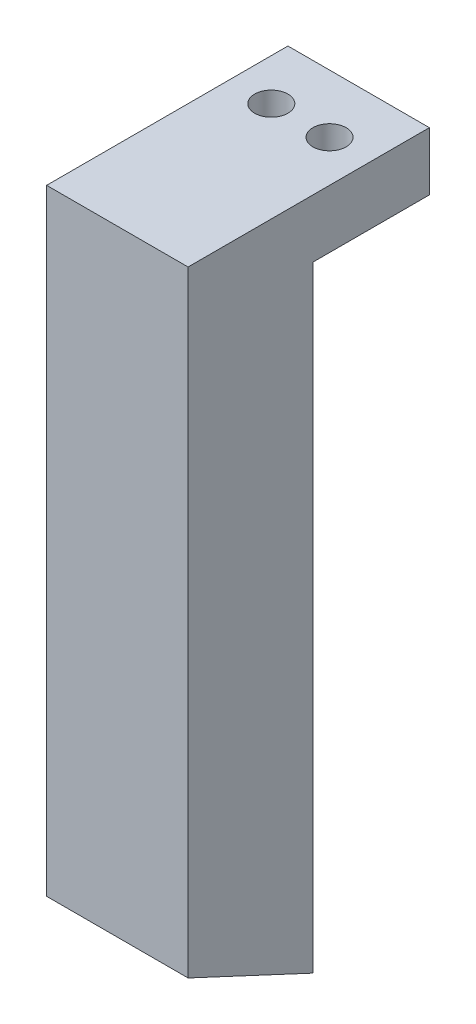
ISO-10303-21;
HEADER;
FILE_DESCRIPTION(('STEP AP214'),'2;1');
FILE_NAME('part.step','',(''),(''),'','','');
FILE_SCHEMA(('AUTOMOTIVE_DESIGN { 1 0 10303 214 1 1 1 1 }'));
ENDSEC;
DATA;
#1=APPLICATION_CONTEXT('core data for automotive mechanical design processes');
#2=APPLICATION_PROTOCOL_DEFINITION('international standard','automotive_design',2000,#1);
#3=PRODUCT_CONTEXT('',#1,'mechanical');
#4=PRODUCT('Part','Part','',(#3));
#5=PRODUCT_RELATED_PRODUCT_CATEGORY('part','',(#4));
#6=PRODUCT_DEFINITION_FORMATION('','',#4);
#7=PRODUCT_DEFINITION_CONTEXT('part definition',#1,'design');
#8=PRODUCT_DEFINITION('design','',#6,#7);
#9=PRODUCT_DEFINITION_SHAPE('','',#8);
#10=(LENGTH_UNIT() NAMED_UNIT(*) SI_UNIT(.MILLI.,.METRE.));
#11=(NAMED_UNIT(*) PLANE_ANGLE_UNIT() SI_UNIT($,.RADIAN.));
#12=(NAMED_UNIT(*) SI_UNIT($,.STERADIAN.) SOLID_ANGLE_UNIT());
#13=UNCERTAINTY_MEASURE_WITH_UNIT(LENGTH_MEASURE(1.E-05),#10,'distance_accuracy_value','');
#14=(GEOMETRIC_REPRESENTATION_CONTEXT(3) GLOBAL_UNCERTAINTY_ASSIGNED_CONTEXT((#13)) GLOBAL_UNIT_ASSIGNED_CONTEXT((#10,
#11,#12)) REPRESENTATION_CONTEXT('',''));
#15=CARTESIAN_POINT('',(0.,0.,0.));
#16=DIRECTION('',(0.,0.,1.));
#17=DIRECTION('',(1.,0.,0.));
#18=AXIS2_PLACEMENT_3D('',#15,#16,#17);
#19=CARTESIAN_POINT('',(-76.9047619047619,81.,-16.0714285714286));
#20=DIRECTION('',(0.,0.,1.));
#21=DIRECTION('',(1.,0.,0.));
#22=AXIS2_PLACEMENT_3D('',#19,#20,#21);
#23=PLANE('',#22);
#24=CARTESIAN_POINT('',(-68.4047619047619,21.4157068063248,-16.0714285714286));
#25=DIRECTION('',(0.,0.,1.));
#26=DIRECTION('',(0.,-1.,0.));
#27=AXIS2_PLACEMENT_3D('',#24,#25,#26);
#28=ELLIPSE('',#27,3.54930237472879,1.5);
#29=CARTESIAN_POINT('',(-68.4047619047619,17.866404431596,-16.0714285714286));
#30=VERTEX_POINT('',#29);
#31=EDGE_CURVE('E130',#30,#30,#28,.T.);
#32=ORIENTED_EDGE('',*,*,#31,.T.);
#33=EDGE_LOOP('',(#32));
#34=FACE_BOUND('',#33,.T.);
#35=DIRECTION('',(-1.,0.,0.));
#36=VECTOR('',#35,1.);
#37=CARTESIAN_POINT('',(-76.9047619047619,74.,-16.0714285714286));
#38=LINE('',#37,#36);
#39=CARTESIAN_POINT('',(-59.9047619047619,74.,-16.0714285714286));
#40=VERTEX_POINT('',#39);
#41=CARTESIAN_POINT('',(-76.9047619047619,74.,-16.0714285714286));
#42=VERTEX_POINT('',#41);
#43=EDGE_CURVE('E50',#40,#42,#38,.T.);
#44=ORIENTED_EDGE('',*,*,#43,.F.);
#45=DIRECTION('',(0.,-1.,0.));
#46=VECTOR('',#45,1.);
#47=CARTESIAN_POINT('',(-59.9047619047619,81.,-16.0714285714286));
#48=LINE('',#47,#46);
#49=CARTESIAN_POINT('',(-59.9047619047619,0.,-16.0714285714286));
#50=VERTEX_POINT('',#49);
#51=EDGE_CURVE('E143',#40,#50,#48,.T.);
#52=ORIENTED_EDGE('',*,*,#51,.T.);
#53=DIRECTION('',(-1.,0.,0.));
#54=VECTOR('',#53,1.);
#55=CARTESIAN_POINT('',(-76.9047619047619,0.,-16.0714285714286));
#56=LINE('',#55,#54);
#57=CARTESIAN_POINT('',(-76.9047619047619,0.,-16.0714285714286));
#58=VERTEX_POINT('',#57);
#59=EDGE_CURVE('E99',#50,#58,#56,.T.);
#60=ORIENTED_EDGE('',*,*,#59,.T.);
#61=DIRECTION('',(0.,-1.,0.));
#62=VECTOR('',#61,1.);
#63=CARTESIAN_POINT('',(-76.9047619047619,81.,-16.0714285714286));
#64=LINE('',#63,#62);
#65=EDGE_CURVE('E69',#42,#58,#64,.T.);
#66=ORIENTED_EDGE('',*,*,#65,.F.);
#67=EDGE_LOOP('',(#44,#52,#60,#66));
#68=FACE_BOUND('',#67,.T.);
#69=ADVANCED_FACE('F35',(#34,#68),#23,.F.);
#70=CARTESIAN_POINT('',(-76.9047619047619,81.,-16.0714285714286));
#71=DIRECTION('',(1.,0.,0.));
#72=DIRECTION('',(0.,0.,-1.));
#73=AXIS2_PLACEMENT_3D('',#70,#71,#72);
#74=PLANE('',#73);
#75=DIRECTION('',(0.,0.,1.));
#76=VECTOR('',#75,1.);
#77=CARTESIAN_POINT('',(-76.9047619047619,81.,-16.0714285714286));
#78=LINE('',#77,#76);
#79=CARTESIAN_POINT('',(-76.9047619047619,81.,-30.0714285714286));
#80=VERTEX_POINT('',#79);
#81=CARTESIAN_POINT('',(-76.9047619047619,81.,-1.07142857142857));
#82=VERTEX_POINT('',#81);
#83=EDGE_CURVE('E95',#80,#82,#78,.T.);
#84=ORIENTED_EDGE('',*,*,#83,.F.);
#85=DIRECTION('',(0.,1.,0.));
#86=VECTOR('',#85,1.);
#87=CARTESIAN_POINT('',(-76.9047619047619,81.,-30.0714285714286));
#88=LINE('',#87,#86);
#89=CARTESIAN_POINT('',(-76.9047619047619,74.,-30.0714285714286));
#90=VERTEX_POINT('',#89);
#91=EDGE_CURVE('E98',#90,#80,#88,.T.);
#92=ORIENTED_EDGE('',*,*,#91,.F.);
#93=DIRECTION('',(0.,0.,1.));
#94=VECTOR('',#93,1.);
#95=CARTESIAN_POINT('',(-76.9047619047619,74.,-30.0714285714286));
#96=LINE('',#95,#94);
#97=EDGE_CURVE('E121',#90,#42,#96,.T.);
#98=ORIENTED_EDGE('',*,*,#97,.T.);
#99=ORIENTED_EDGE('',*,*,#65,.T.);
#100=DIRECTION('',(0.,0.422618261740694,0.906307787036653));
#101=VECTOR('',#100,1.);
#102=CARTESIAN_POINT('',(-76.9047619047619,14.4671018076948,14.9533713748897));
#103=LINE('',#102,#101);
#104=CARTESIAN_POINT('',(-76.9047619047619,6.99461487232486,-1.07142857142857));
#105=VERTEX_POINT('',#104);
#106=EDGE_CURVE('E136',#58,#105,#103,.T.);
#107=ORIENTED_EDGE('',*,*,#106,.T.);
#108=DIRECTION('',(0.,-1.,0.));
#109=VECTOR('',#108,1.);
#110=CARTESIAN_POINT('',(-76.9047619047619,81.,-1.07142857142857));
#111=LINE('',#110,#109);
#112=EDGE_CURVE('E11',#82,#105,#111,.T.);
#113=ORIENTED_EDGE('',*,*,#112,.F.);
#114=EDGE_LOOP('',(#84,#92,#98,#99,#107,#113));
#115=FACE_BOUND('',#114,.T.);
#116=ADVANCED_FACE('F37',(#115),#74,.F.);
#117=CARTESIAN_POINT('',(-76.9047619047619,81.,-1.07142857142857));
#118=DIRECTION('',(0.,0.,-1.));
#119=DIRECTION('',(-1.,0.,0.));
#120=AXIS2_PLACEMENT_3D('',#117,#118,#119);
#121=PLANE('',#120);
#122=ORIENTED_EDGE('',*,*,#112,.T.);
#123=DIRECTION('',(1.,0.,0.));
#124=VECTOR('',#123,1.);
#125=CARTESIAN_POINT('',(-99.9047619047619,6.99461487232486,-1.07142857142857));
#126=LINE('',#125,#124);
#127=CARTESIAN_POINT('',(-59.9047619047619,6.99461487232486,-1.07142857142857));
#128=VERTEX_POINT('',#127);
#129=EDGE_CURVE('E76',#105,#128,#126,.T.);
#130=ORIENTED_EDGE('',*,*,#129,.T.);
#131=DIRECTION('',(0.,-1.,0.));
#132=VECTOR('',#131,1.);
#133=CARTESIAN_POINT('',(-59.9047619047619,81.,-1.07142857142857));
#134=LINE('',#133,#132);
#135=CARTESIAN_POINT('',(-59.9047619047619,81.,-1.07142857142857));
#136=VERTEX_POINT('',#135);
#137=EDGE_CURVE('E43',#136,#128,#134,.T.);
#138=ORIENTED_EDGE('',*,*,#137,.F.);
#139=DIRECTION('',(1.,0.,0.));
#140=VECTOR('',#139,1.);
#141=CARTESIAN_POINT('',(-76.9047619047619,81.,-1.07142857142857));
#142=LINE('',#141,#140);
#143=EDGE_CURVE('E59',#82,#136,#142,.T.);
#144=ORIENTED_EDGE('',*,*,#143,.F.);
#145=EDGE_LOOP('',(#122,#130,#138,#144));
#146=FACE_BOUND('',#145,.T.);
#147=ADVANCED_FACE('F149',(#146),#121,.F.);
#148=CARTESIAN_POINT('',(-59.9047619047619,81.,-16.0714285714286));
#149=DIRECTION('',(-1.,0.,0.));
#150=DIRECTION('',(0.,0.,1.));
#151=AXIS2_PLACEMENT_3D('',#148,#149,#150);
#152=PLANE('',#151);
#153=ORIENTED_EDGE('',*,*,#137,.T.);
#154=DIRECTION('',(0.,0.422618261740694,0.906307787036653));
#155=VECTOR('',#154,1.);
#156=CARTESIAN_POINT('',(-59.9047619047619,6.99461487232486,-1.07142857142857));
#157=LINE('',#156,#155);
#158=EDGE_CURVE('E133',#50,#128,#157,.T.);
#159=ORIENTED_EDGE('',*,*,#158,.F.);
#160=ORIENTED_EDGE('',*,*,#51,.F.);
#161=DIRECTION('',(0.,0.,1.));
#162=VECTOR('',#161,1.);
#163=CARTESIAN_POINT('',(-59.9047619047619,74.,-30.0714285714286));
#164=LINE('',#163,#162);
#165=CARTESIAN_POINT('',(-59.9047619047619,74.,-30.0714285714286));
#166=VERTEX_POINT('',#165);
#167=EDGE_CURVE('E124',#166,#40,#164,.T.);
#168=ORIENTED_EDGE('',*,*,#167,.F.);
#169=DIRECTION('',(0.,-1.,0.));
#170=VECTOR('',#169,1.);
#171=CARTESIAN_POINT('',(-59.9047619047619,81.,-30.0714285714286));
#172=LINE('',#171,#170);
#173=CARTESIAN_POINT('',(-59.9047619047619,81.,-30.0714285714286));
#174=VERTEX_POINT('',#173);
#175=EDGE_CURVE('E108',#174,#166,#172,.T.);
#176=ORIENTED_EDGE('',*,*,#175,.F.);
#177=DIRECTION('',(0.,0.,-1.));
#178=VECTOR('',#177,1.);
#179=CARTESIAN_POINT('',(-59.9047619047619,81.,-16.0714285714286));
#180=LINE('',#179,#178);
#181=EDGE_CURVE('E105',#136,#174,#180,.T.);
#182=ORIENTED_EDGE('',*,*,#181,.F.);
#183=EDGE_LOOP('',(#153,#159,#160,#168,#176,#182));
#184=FACE_BOUND('',#183,.T.);
#185=ADVANCED_FACE('F147',(#184),#152,.F.);
#186=CARTESIAN_POINT('',(0.,81.,0.));
#187=DIRECTION('',(0.,1.,0.));
#188=DIRECTION('',(0.,0.,1.));
#189=AXIS2_PLACEMENT_3D('',#186,#187,#188);
#190=PLANE('',#189);
#191=CARTESIAN_POINT('',(-71.9047619047619,81.,-23.0714285714286));
#192=DIRECTION('',(0.,1.,0.));
#193=DIRECTION('',(0.,0.,1.));
#194=AXIS2_PLACEMENT_3D('',#191,#192,#193);
#195=CIRCLE('',#194,2.);
#196=CARTESIAN_POINT('',(-71.9047619047619,81.,-21.0714285714286));
#197=VERTEX_POINT('',#196);
#198=EDGE_CURVE('E115',#197,#197,#195,.T.);
#199=ORIENTED_EDGE('',*,*,#198,.F.);
#200=EDGE_LOOP('',(#199));
#201=FACE_BOUND('',#200,.T.);
#202=CARTESIAN_POINT('',(-64.9047619047619,81.,-23.0714285714286));
#203=DIRECTION('',(0.,1.,0.));
#204=DIRECTION('',(0.,0.,1.));
#205=AXIS2_PLACEMENT_3D('',#202,#203,#204);
#206=CIRCLE('',#205,2.);
#207=CARTESIAN_POINT('',(-64.9047619047619,81.,-21.0714285714286));
#208=VERTEX_POINT('',#207);
#209=EDGE_CURVE('E194',#208,#208,#206,.T.);
#210=ORIENTED_EDGE('',*,*,#209,.F.);
#211=EDGE_LOOP('',(#210));
#212=FACE_BOUND('',#211,.T.);
#213=ORIENTED_EDGE('',*,*,#83,.T.);
#214=ORIENTED_EDGE('',*,*,#143,.T.);
#215=ORIENTED_EDGE('',*,*,#181,.T.);
#216=DIRECTION('',(1.,0.,0.));
#217=VECTOR('',#216,1.);
#218=CARTESIAN_POINT('',(-76.9047619047619,81.,-30.0714285714286));
#219=LINE('',#218,#217);
#220=EDGE_CURVE('E102',#80,#174,#219,.T.);
#221=ORIENTED_EDGE('',*,*,#220,.F.);
#222=EDGE_LOOP('',(#213,#214,#215,#221));
#223=FACE_BOUND('',#222,.T.);
#224=ADVANCED_FACE('F103',(#201,#212,#223),#190,.T.);
#225=CARTESIAN_POINT('',(-99.9047619047619,6.99461487232486,-1.07142857142857));
#226=DIRECTION('',(0.,0.906307787036653,-0.422618261740694));
#227=DIRECTION('',(0.,0.422618261740694,0.906307787036653));
#228=AXIS2_PLACEMENT_3D('',#225,#226,#227);
#229=PLANE('',#228);
#230=CARTESIAN_POINT('',(-68.4047619047619,3.82497790926966,-7.86873697420347));
#231=DIRECTION('',(0.,-0.906307787036653,0.422618261740693));
#232=DIRECTION('',(0.,-0.422618261740693,-0.906307787036653));
#233=AXIS2_PLACEMENT_3D('',#230,#231,#232);
#234=CIRCLE('',#233,1.5);
#235=CARTESIAN_POINT('',(-68.4047619047619,3.19105051665862,-9.22819865475844));
#236=VERTEX_POINT('',#235);
#237=EDGE_CURVE('E127',#236,#236,#234,.T.);
#238=ORIENTED_EDGE('',*,*,#237,.F.);
#239=EDGE_LOOP('',(#238));
#240=FACE_BOUND('',#239,.T.);
#241=ORIENTED_EDGE('',*,*,#59,.F.);
#242=ORIENTED_EDGE('',*,*,#158,.T.);
#243=ORIENTED_EDGE('',*,*,#129,.F.);
#244=ORIENTED_EDGE('',*,*,#106,.F.);
#245=EDGE_LOOP('',(#241,#242,#243,#244));
#246=FACE_BOUND('',#245,.T.);
#247=ADVANCED_FACE('F164',(#240,#246),#229,.F.);
#248=CARTESIAN_POINT('',(-68.4047619047619,36.4520582425892,-23.0829943968684));
#249=DIRECTION('',(0.,-0.906307787036653,0.422618261740693));
#250=DIRECTION('',(0.,-0.422618261740693,-0.906307787036653));
#251=AXIS2_PLACEMENT_3D('',#248,#249,#250);
#252=CYLINDRICAL_SURFACE('',#251,1.5);
#253=ORIENTED_EDGE('',*,*,#237,.T.);
#254=EDGE_LOOP('',(#253));
#255=FACE_BOUND('',#254,.T.);
#256=ORIENTED_EDGE('',*,*,#31,.F.);
#257=EDGE_LOOP('',(#256));
#258=FACE_BOUND('',#257,.T.);
#259=ADVANCED_FACE('F168',(#255,#258),#252,.F.);
#260=CARTESIAN_POINT('',(-76.9047619047619,74.,-30.0714285714286));
#261=DIRECTION('',(0.,1.,0.));
#262=DIRECTION('',(-1.,0.,0.));
#263=AXIS2_PLACEMENT_3D('',#260,#261,#262);
#264=PLANE('',#263);
#265=CARTESIAN_POINT('',(-71.9047619047619,74.0000000000001,-23.0714285714286));
#266=DIRECTION('',(0.,-1.,0.));
#267=DIRECTION('',(0.,0.,-1.));
#268=AXIS2_PLACEMENT_3D('',#265,#266,#267);
#269=CIRCLE('',#268,2.);
#270=CARTESIAN_POINT('',(-71.9047619047619,74.0000000000001,-25.0714285714286));
#271=VERTEX_POINT('',#270);
#272=EDGE_CURVE('E193',#271,#271,#269,.T.);
#273=ORIENTED_EDGE('',*,*,#272,.F.);
#274=EDGE_LOOP('',(#273));
#275=FACE_BOUND('',#274,.T.);
#276=CARTESIAN_POINT('',(-64.9047619047619,74.0000000000001,-23.0714285714286));
#277=DIRECTION('',(0.,-1.,0.));
#278=DIRECTION('',(0.,0.,-1.));
#279=AXIS2_PLACEMENT_3D('',#276,#277,#278);
#280=CIRCLE('',#279,2.);
#281=CARTESIAN_POINT('',(-64.9047619047619,74.0000000000001,-25.0714285714286));
#282=VERTEX_POINT('',#281);
#283=EDGE_CURVE('E195',#282,#282,#280,.T.);
#284=ORIENTED_EDGE('',*,*,#283,.F.);
#285=EDGE_LOOP('',(#284));
#286=FACE_BOUND('',#285,.T.);
#287=ORIENTED_EDGE('',*,*,#43,.T.);
#288=ORIENTED_EDGE('',*,*,#97,.F.);
#289=DIRECTION('',(-1.,0.,0.));
#290=VECTOR('',#289,1.);
#291=CARTESIAN_POINT('',(-76.9047619047619,74.,-30.0714285714286));
#292=LINE('',#291,#290);
#293=EDGE_CURVE('E112',#166,#90,#292,.T.);
#294=ORIENTED_EDGE('',*,*,#293,.F.);
#295=ORIENTED_EDGE('',*,*,#167,.T.);
#296=EDGE_LOOP('',(#287,#288,#294,#295));
#297=FACE_BOUND('',#296,.T.);
#298=ADVANCED_FACE('F172',(#275,#286,#297),#264,.F.);
#299=CARTESIAN_POINT('',(0.,0.,-30.0714285714286));
#300=DIRECTION('',(0.,0.,1.));
#301=DIRECTION('',(1.,0.,0.));
#302=AXIS2_PLACEMENT_3D('',#299,#300,#301);
#303=PLANE('',#302);
#304=ORIENTED_EDGE('',*,*,#91,.T.);
#305=ORIENTED_EDGE('',*,*,#220,.T.);
#306=ORIENTED_EDGE('',*,*,#175,.T.);
#307=ORIENTED_EDGE('',*,*,#293,.T.);
#308=EDGE_LOOP('',(#304,#305,#306,#307));
#309=FACE_BOUND('',#308,.T.);
#310=ADVANCED_FACE('F110',(#309),#303,.F.);
#311=CARTESIAN_POINT('',(-64.9047619047619,88.0000000000001,-23.0714285714286));
#312=DIRECTION('',(0.,-1.,0.));
#313=DIRECTION('',(0.,0.,-1.));
#314=AXIS2_PLACEMENT_3D('',#311,#312,#313);
#315=CYLINDRICAL_SURFACE('',#314,2.);
#316=ORIENTED_EDGE('',*,*,#209,.T.);
#317=EDGE_LOOP('',(#316));
#318=FACE_BOUND('',#317,.T.);
#319=ORIENTED_EDGE('',*,*,#283,.T.);
#320=EDGE_LOOP('',(#319));
#321=FACE_BOUND('',#320,.T.);
#322=ADVANCED_FACE('F179',(#318,#321),#315,.F.);
#323=CARTESIAN_POINT('',(-71.9047619047619,88.0000000000001,-23.0714285714286));
#324=DIRECTION('',(0.,-1.,0.));
#325=DIRECTION('',(0.,0.,-1.));
#326=AXIS2_PLACEMENT_3D('',#323,#324,#325);
#327=CYLINDRICAL_SURFACE('',#326,2.);
#328=ORIENTED_EDGE('',*,*,#198,.T.);
#329=EDGE_LOOP('',(#328));
#330=FACE_BOUND('',#329,.T.);
#331=ORIENTED_EDGE('',*,*,#272,.T.);
#332=EDGE_LOOP('',(#331));
#333=FACE_BOUND('',#332,.T.);
#334=ADVANCED_FACE('F182',(#330,#333),#327,.F.);
#335=CLOSED_SHELL('',(#69,#116,#147,#185,#224,#247,#259,#298,#310,#322,#334));
#336=MANIFOLD_SOLID_BREP('B2',#335);
#337=ADVANCED_BREP_SHAPE_REPRESENTATION('',(#18,#336),#14);
#338=SHAPE_DEFINITION_REPRESENTATION(#9,#337);
ENDSEC;
END-ISO-10303-21;
